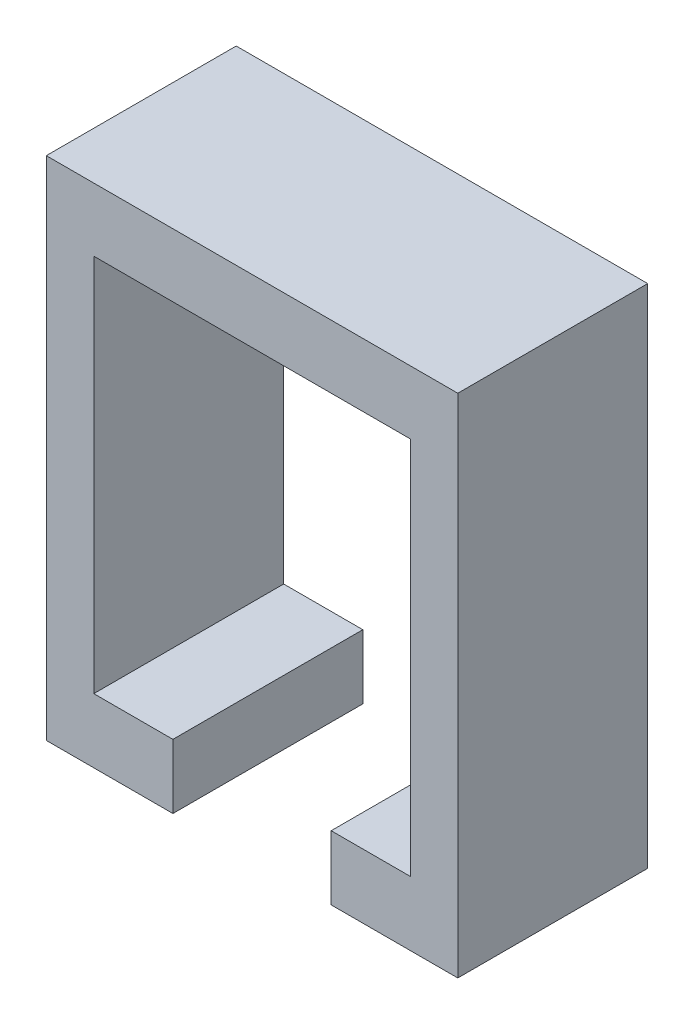
ISO-10303-21;
HEADER;
FILE_DESCRIPTION(('STEP AP214'),'2;1');
FILE_NAME('part.step','',(''),(''),'','','');
FILE_SCHEMA(('AUTOMOTIVE_DESIGN { 1 0 10303 214 1 1 1 1 }'));
ENDSEC;
DATA;
#1=APPLICATION_CONTEXT('core data for automotive mechanical design processes');
#2=APPLICATION_PROTOCOL_DEFINITION('international standard','automotive_design',2000,#1);
#3=PRODUCT_CONTEXT('',#1,'mechanical');
#4=PRODUCT('Part','Part','',(#3));
#5=PRODUCT_RELATED_PRODUCT_CATEGORY('part','',(#4));
#6=PRODUCT_DEFINITION_FORMATION('','',#4);
#7=PRODUCT_DEFINITION_CONTEXT('part definition',#1,'design');
#8=PRODUCT_DEFINITION('design','',#6,#7);
#9=PRODUCT_DEFINITION_SHAPE('','',#8);
#10=(LENGTH_UNIT() NAMED_UNIT(*) SI_UNIT(.MILLI.,.METRE.));
#11=(NAMED_UNIT(*) PLANE_ANGLE_UNIT() SI_UNIT($,.RADIAN.));
#12=(NAMED_UNIT(*) SI_UNIT($,.STERADIAN.) SOLID_ANGLE_UNIT());
#13=UNCERTAINTY_MEASURE_WITH_UNIT(LENGTH_MEASURE(1.E-05),#10,'distance_accuracy_value','');
#14=(GEOMETRIC_REPRESENTATION_CONTEXT(3) GLOBAL_UNCERTAINTY_ASSIGNED_CONTEXT((#13)) GLOBAL_UNIT_ASSIGNED_CONTEXT((#10,
#11,#12)) REPRESENTATION_CONTEXT('',''));
#15=CARTESIAN_POINT('',(0.,0.,0.));
#16=DIRECTION('',(0.,0.,1.));
#17=DIRECTION('',(1.,0.,0.));
#18=AXIS2_PLACEMENT_3D('',#15,#16,#17);
#19=CARTESIAN_POINT('',(-2.5,-16.,6.));
#20=DIRECTION('',(0.,1.,0.));
#21=DIRECTION('',(-1.,0.,0.));
#22=AXIS2_PLACEMENT_3D('',#19,#20,#21);
#23=PLANE('',#22);
#24=DIRECTION('',(1.,0.,0.));
#25=VECTOR('',#24,1.);
#26=CARTESIAN_POINT('',(-2.5,-16.,0.));
#27=LINE('',#26,#25);
#28=CARTESIAN_POINT('',(-6.5,-16.,0.));
#29=VERTEX_POINT('',#28);
#30=CARTESIAN_POINT('',(-2.5,-16.,0.));
#31=VERTEX_POINT('',#30);
#32=EDGE_CURVE('E170',#29,#31,#27,.T.);
#33=ORIENTED_EDGE('',*,*,#32,.T.);
#34=DIRECTION('',(0.,0.,-1.));
#35=VECTOR('',#34,1.);
#36=CARTESIAN_POINT('',(-2.5,-16.,6.));
#37=LINE('',#36,#35);
#38=CARTESIAN_POINT('',(-2.5,-16.,6.));
#39=VERTEX_POINT('',#38);
#40=EDGE_CURVE('E11',#39,#31,#37,.T.);
#41=ORIENTED_EDGE('',*,*,#40,.F.);
#42=DIRECTION('',(1.,0.,0.));
#43=VECTOR('',#42,1.);
#44=CARTESIAN_POINT('',(-2.5,-16.,6.));
#45=LINE('',#44,#43);
#46=CARTESIAN_POINT('',(-6.5,-16.,6.));
#47=VERTEX_POINT('',#46);
#48=EDGE_CURVE('E204',#47,#39,#45,.T.);
#49=ORIENTED_EDGE('',*,*,#48,.F.);
#50=DIRECTION('',(0.,0.,-1.));
#51=VECTOR('',#50,1.);
#52=CARTESIAN_POINT('',(-6.5,-16.,6.));
#53=LINE('',#52,#51);
#54=EDGE_CURVE('E166',#47,#29,#53,.T.);
#55=ORIENTED_EDGE('',*,*,#54,.T.);
#56=EDGE_LOOP('',(#33,#41,#49,#55));
#57=FACE_BOUND('',#56,.T.);
#58=ADVANCED_FACE('F45',(#57),#23,.F.);
#59=CARTESIAN_POINT('',(-2.5,-13.97,6.));
#60=DIRECTION('',(-1.,0.,0.));
#61=DIRECTION('',(0.,0.,1.));
#62=AXIS2_PLACEMENT_3D('',#59,#60,#61);
#63=PLANE('',#62);
#64=DIRECTION('',(0.,1.,0.));
#65=VECTOR('',#64,1.);
#66=CARTESIAN_POINT('',(-2.5,-13.97,0.));
#67=LINE('',#66,#65);
#68=CARTESIAN_POINT('',(-2.5,-13.97,0.));
#69=VERTEX_POINT('',#68);
#70=EDGE_CURVE('E174',#31,#69,#67,.T.);
#71=ORIENTED_EDGE('',*,*,#70,.T.);
#72=DIRECTION('',(0.,0.,-1.));
#73=VECTOR('',#72,1.);
#74=CARTESIAN_POINT('',(-2.5,-13.97,6.));
#75=LINE('',#74,#73);
#76=CARTESIAN_POINT('',(-2.5,-13.97,6.));
#77=VERTEX_POINT('',#76);
#78=EDGE_CURVE('E54',#77,#69,#75,.T.);
#79=ORIENTED_EDGE('',*,*,#78,.F.);
#80=DIRECTION('',(0.,1.,0.));
#81=VECTOR('',#80,1.);
#82=CARTESIAN_POINT('',(-2.5,-13.97,6.));
#83=LINE('',#82,#81);
#84=EDGE_CURVE('E117',#39,#77,#83,.T.);
#85=ORIENTED_EDGE('',*,*,#84,.F.);
#86=ORIENTED_EDGE('',*,*,#40,.T.);
#87=EDGE_LOOP('',(#71,#79,#85,#86));
#88=FACE_BOUND('',#87,.T.);
#89=ADVANCED_FACE('F298',(#88),#63,.F.);
#90=CARTESIAN_POINT('',(-5.,-13.97,6.));
#91=DIRECTION('',(0.,-1.,0.));
#92=DIRECTION('',(0.,0.,-1.));
#93=AXIS2_PLACEMENT_3D('',#90,#91,#92);
#94=PLANE('',#93);
#95=DIRECTION('',(-1.,0.,0.));
#96=VECTOR('',#95,1.);
#97=CARTESIAN_POINT('',(-5.,-13.97,0.));
#98=LINE('',#97,#96);
#99=CARTESIAN_POINT('',(-5.,-13.97,0.));
#100=VERTEX_POINT('',#99);
#101=EDGE_CURVE('E177',#69,#100,#98,.T.);
#102=ORIENTED_EDGE('',*,*,#101,.T.);
#103=DIRECTION('',(0.,0.,-1.));
#104=VECTOR('',#103,1.);
#105=CARTESIAN_POINT('',(-5.,-13.97,6.));
#106=LINE('',#105,#104);
#107=CARTESIAN_POINT('',(-5.,-13.97,6.));
#108=VERTEX_POINT('',#107);
#109=EDGE_CURVE('E231',#108,#100,#106,.T.);
#110=ORIENTED_EDGE('',*,*,#109,.F.);
#111=DIRECTION('',(-1.,0.,0.));
#112=VECTOR('',#111,1.);
#113=CARTESIAN_POINT('',(-5.,-13.97,6.));
#114=LINE('',#113,#112);
#115=EDGE_CURVE('E241',#77,#108,#114,.T.);
#116=ORIENTED_EDGE('',*,*,#115,.F.);
#117=ORIENTED_EDGE('',*,*,#78,.T.);
#118=EDGE_LOOP('',(#102,#110,#116,#117));
#119=FACE_BOUND('',#118,.T.);
#120=ADVANCED_FACE('F239',(#119),#94,.F.);
#121=CARTESIAN_POINT('',(-5.,-2.,6.));
#122=DIRECTION('',(-1.,0.,0.));
#123=DIRECTION('',(0.,0.,1.));
#124=AXIS2_PLACEMENT_3D('',#121,#122,#123);
#125=PLANE('',#124);
#126=DIRECTION('',(0.,1.,0.));
#127=VECTOR('',#126,1.);
#128=CARTESIAN_POINT('',(-5.,-2.,0.));
#129=LINE('',#128,#127);
#130=CARTESIAN_POINT('',(-5.,-2.,0.));
#131=VERTEX_POINT('',#130);
#132=EDGE_CURVE('E180',#100,#131,#129,.T.);
#133=ORIENTED_EDGE('',*,*,#132,.T.);
#134=DIRECTION('',(0.,0.,-1.));
#135=VECTOR('',#134,1.);
#136=CARTESIAN_POINT('',(-5.,-2.,6.));
#137=LINE('',#136,#135);
#138=CARTESIAN_POINT('',(-5.,-2.,6.));
#139=VERTEX_POINT('',#138);
#140=EDGE_CURVE('E227',#139,#131,#137,.T.);
#141=ORIENTED_EDGE('',*,*,#140,.F.);
#142=DIRECTION('',(0.,1.,0.));
#143=VECTOR('',#142,1.);
#144=CARTESIAN_POINT('',(-5.,-2.,6.));
#145=LINE('',#144,#143);
#146=EDGE_CURVE('E260',#108,#139,#145,.T.);
#147=ORIENTED_EDGE('',*,*,#146,.F.);
#148=ORIENTED_EDGE('',*,*,#109,.T.);
#149=EDGE_LOOP('',(#133,#141,#147,#148));
#150=FACE_BOUND('',#149,.T.);
#151=ADVANCED_FACE('F250',(#150),#125,.F.);
#152=CARTESIAN_POINT('',(-5.,-2.,6.));
#153=DIRECTION('',(0.,1.,0.));
#154=DIRECTION('',(0.,0.,1.));
#155=AXIS2_PLACEMENT_3D('',#152,#153,#154);
#156=PLANE('',#155);
#157=DIRECTION('',(1.,0.,0.));
#158=VECTOR('',#157,1.);
#159=CARTESIAN_POINT('',(-5.,-2.,0.));
#160=LINE('',#159,#158);
#161=CARTESIAN_POINT('',(5.,-2.,0.));
#162=VERTEX_POINT('',#161);
#163=EDGE_CURVE('E183',#131,#162,#160,.T.);
#164=ORIENTED_EDGE('',*,*,#163,.T.);
#165=DIRECTION('',(0.,0.,-1.));
#166=VECTOR('',#165,1.);
#167=CARTESIAN_POINT('',(5.,-2.,6.));
#168=LINE('',#167,#166);
#169=CARTESIAN_POINT('',(5.,-2.,6.));
#170=VERTEX_POINT('',#169);
#171=EDGE_CURVE('E223',#170,#162,#168,.T.);
#172=ORIENTED_EDGE('',*,*,#171,.F.);
#173=DIRECTION('',(1.,0.,0.));
#174=VECTOR('',#173,1.);
#175=CARTESIAN_POINT('',(-5.,-2.,6.));
#176=LINE('',#175,#174);
#177=EDGE_CURVE('E256',#139,#170,#176,.T.);
#178=ORIENTED_EDGE('',*,*,#177,.F.);
#179=ORIENTED_EDGE('',*,*,#140,.T.);
#180=EDGE_LOOP('',(#164,#172,#178,#179));
#181=FACE_BOUND('',#180,.T.);
#182=ADVANCED_FACE('F254',(#181),#156,.F.);
#183=CARTESIAN_POINT('',(5.,-2.,6.));
#184=DIRECTION('',(1.,0.,0.));
#185=DIRECTION('',(0.,1.,0.));
#186=AXIS2_PLACEMENT_3D('',#183,#184,#185);
#187=PLANE('',#186);
#188=DIRECTION('',(0.,-1.,0.));
#189=VECTOR('',#188,1.);
#190=CARTESIAN_POINT('',(5.,-2.,0.));
#191=LINE('',#190,#189);
#192=CARTESIAN_POINT('',(5.,-13.97,0.));
#193=VERTEX_POINT('',#192);
#194=EDGE_CURVE('E186',#162,#193,#191,.T.);
#195=ORIENTED_EDGE('',*,*,#194,.T.);
#196=DIRECTION('',(0.,0.,-1.));
#197=VECTOR('',#196,1.);
#198=CARTESIAN_POINT('',(5.,-13.97,6.));
#199=LINE('',#198,#197);
#200=CARTESIAN_POINT('',(5.,-13.97,6.));
#201=VERTEX_POINT('',#200);
#202=EDGE_CURVE('E219',#201,#193,#199,.T.);
#203=ORIENTED_EDGE('',*,*,#202,.F.);
#204=DIRECTION('',(0.,-1.,0.));
#205=VECTOR('',#204,1.);
#206=CARTESIAN_POINT('',(5.,-2.,6.));
#207=LINE('',#206,#205);
#208=EDGE_CURVE('E259',#170,#201,#207,.T.);
#209=ORIENTED_EDGE('',*,*,#208,.F.);
#210=ORIENTED_EDGE('',*,*,#171,.T.);
#211=EDGE_LOOP('',(#195,#203,#209,#210));
#212=FACE_BOUND('',#211,.T.);
#213=ADVANCED_FACE('F311',(#212),#187,.F.);
#214=CARTESIAN_POINT('',(5.,-13.97,6.));
#215=DIRECTION('',(0.,-1.,0.));
#216=DIRECTION('',(0.,0.,-1.));
#217=AXIS2_PLACEMENT_3D('',#214,#215,#216);
#218=PLANE('',#217);
#219=DIRECTION('',(-1.,0.,0.));
#220=VECTOR('',#219,1.);
#221=CARTESIAN_POINT('',(5.,-13.97,0.));
#222=LINE('',#221,#220);
#223=CARTESIAN_POINT('',(2.5,-13.97,0.));
#224=VERTEX_POINT('',#223);
#225=EDGE_CURVE('E189',#193,#224,#222,.T.);
#226=ORIENTED_EDGE('',*,*,#225,.T.);
#227=DIRECTION('',(0.,0.,-1.));
#228=VECTOR('',#227,1.);
#229=CARTESIAN_POINT('',(2.5,-13.97,6.));
#230=LINE('',#229,#228);
#231=CARTESIAN_POINT('',(2.5,-13.97,6.));
#232=VERTEX_POINT('',#231);
#233=EDGE_CURVE('E215',#232,#224,#230,.T.);
#234=ORIENTED_EDGE('',*,*,#233,.F.);
#235=DIRECTION('',(-1.,0.,0.));
#236=VECTOR('',#235,1.);
#237=CARTESIAN_POINT('',(5.,-13.97,6.));
#238=LINE('',#237,#236);
#239=EDGE_CURVE('E264',#201,#232,#238,.T.);
#240=ORIENTED_EDGE('',*,*,#239,.F.);
#241=ORIENTED_EDGE('',*,*,#202,.T.);
#242=EDGE_LOOP('',(#226,#234,#240,#241));
#243=FACE_BOUND('',#242,.T.);
#244=ADVANCED_FACE('F314',(#243),#218,.F.);
#245=CARTESIAN_POINT('',(2.5,-13.97,6.));
#246=DIRECTION('',(1.,0.,0.));
#247=DIRECTION('',(0.,0.,-1.));
#248=AXIS2_PLACEMENT_3D('',#245,#246,#247);
#249=PLANE('',#248);
#250=DIRECTION('',(0.,-1.,0.));
#251=VECTOR('',#250,1.);
#252=CARTESIAN_POINT('',(2.5,-13.97,0.));
#253=LINE('',#252,#251);
#254=CARTESIAN_POINT('',(2.5,-16.,0.));
#255=VERTEX_POINT('',#254);
#256=EDGE_CURVE('E192',#224,#255,#253,.T.);
#257=ORIENTED_EDGE('',*,*,#256,.T.);
#258=DIRECTION('',(0.,0.,-1.));
#259=VECTOR('',#258,1.);
#260=CARTESIAN_POINT('',(2.5,-16.,6.));
#261=LINE('',#260,#259);
#262=CARTESIAN_POINT('',(2.5,-16.,6.));
#263=VERTEX_POINT('',#262);
#264=EDGE_CURVE('E211',#263,#255,#261,.T.);
#265=ORIENTED_EDGE('',*,*,#264,.F.);
#266=DIRECTION('',(0.,-1.,0.));
#267=VECTOR('',#266,1.);
#268=CARTESIAN_POINT('',(2.5,-13.97,6.));
#269=LINE('',#268,#267);
#270=EDGE_CURVE('E271',#232,#263,#269,.T.);
#271=ORIENTED_EDGE('',*,*,#270,.F.);
#272=ORIENTED_EDGE('',*,*,#233,.T.);
#273=EDGE_LOOP('',(#257,#265,#271,#272));
#274=FACE_BOUND('',#273,.T.);
#275=ADVANCED_FACE('F279',(#274),#249,.F.);
#276=CARTESIAN_POINT('',(2.5,-16.,6.));
#277=DIRECTION('',(0.,1.,0.));
#278=DIRECTION('',(0.,0.,1.));
#279=AXIS2_PLACEMENT_3D('',#276,#277,#278);
#280=PLANE('',#279);
#281=DIRECTION('',(1.,0.,0.));
#282=VECTOR('',#281,1.);
#283=CARTESIAN_POINT('',(2.5,-16.,0.));
#284=LINE('',#283,#282);
#285=CARTESIAN_POINT('',(6.50000000000001,-16.,0.));
#286=VERTEX_POINT('',#285);
#287=EDGE_CURVE('E195',#255,#286,#284,.T.);
#288=ORIENTED_EDGE('',*,*,#287,.T.);
#289=DIRECTION('',(0.,0.,-1.));
#290=VECTOR('',#289,1.);
#291=CARTESIAN_POINT('',(6.50000000000001,-16.,6.));
#292=LINE('',#291,#290);
#293=CARTESIAN_POINT('',(6.50000000000001,-16.,6.));
#294=VERTEX_POINT('',#293);
#295=EDGE_CURVE('E159',#294,#286,#292,.T.);
#296=ORIENTED_EDGE('',*,*,#295,.F.);
#297=DIRECTION('',(1.,0.,0.));
#298=VECTOR('',#297,1.);
#299=CARTESIAN_POINT('',(2.5,-16.,6.));
#300=LINE('',#299,#298);
#301=EDGE_CURVE('E148',#263,#294,#300,.T.);
#302=ORIENTED_EDGE('',*,*,#301,.F.);
#303=ORIENTED_EDGE('',*,*,#264,.T.);
#304=EDGE_LOOP('',(#288,#296,#302,#303));
#305=FACE_BOUND('',#304,.T.);
#306=ADVANCED_FACE('F283',(#305),#280,.F.);
#307=CARTESIAN_POINT('',(6.5,0.,6.));
#308=DIRECTION('',(-1.,0.,0.));
#309=DIRECTION('',(0.,-1.,0.));
#310=AXIS2_PLACEMENT_3D('',#307,#308,#309);
#311=PLANE('',#310);
#312=DIRECTION('',(0.,1.,0.));
#313=VECTOR('',#312,1.);
#314=CARTESIAN_POINT('',(6.5,0.,0.));
#315=LINE('',#314,#313);
#316=CARTESIAN_POINT('',(6.5,0.,0.));
#317=VERTEX_POINT('',#316);
#318=EDGE_CURVE('E157',#286,#317,#315,.T.);
#319=ORIENTED_EDGE('',*,*,#318,.T.);
#320=DIRECTION('',(0.,0.,-1.));
#321=VECTOR('',#320,1.);
#322=CARTESIAN_POINT('',(6.5,0.,6.));
#323=LINE('',#322,#321);
#324=CARTESIAN_POINT('',(6.5,0.,6.));
#325=VERTEX_POINT('',#324);
#326=EDGE_CURVE('E154',#325,#317,#323,.T.);
#327=ORIENTED_EDGE('',*,*,#326,.F.);
#328=DIRECTION('',(0.,1.,0.));
#329=VECTOR('',#328,1.);
#330=CARTESIAN_POINT('',(6.5,0.,6.));
#331=LINE('',#330,#329);
#332=EDGE_CURVE('E142',#294,#325,#331,.T.);
#333=ORIENTED_EDGE('',*,*,#332,.F.);
#334=ORIENTED_EDGE('',*,*,#295,.T.);
#335=EDGE_LOOP('',(#319,#327,#333,#334));
#336=FACE_BOUND('',#335,.T.);
#337=ADVANCED_FACE('F155',(#336),#311,.F.);
#338=CARTESIAN_POINT('',(-6.5,0.,6.));
#339=DIRECTION('',(0.,-1.,0.));
#340=DIRECTION('',(1.,0.,0.));
#341=AXIS2_PLACEMENT_3D('',#338,#339,#340);
#342=PLANE('',#341);
#343=DIRECTION('',(-1.,0.,0.));
#344=VECTOR('',#343,1.);
#345=CARTESIAN_POINT('',(-6.5,0.,0.));
#346=LINE('',#345,#344);
#347=CARTESIAN_POINT('',(-6.5,0.,0.));
#348=VERTEX_POINT('',#347);
#349=EDGE_CURVE('E103',#317,#348,#346,.T.);
#350=ORIENTED_EDGE('',*,*,#349,.T.);
#351=DIRECTION('',(0.,0.,-1.));
#352=VECTOR('',#351,1.);
#353=CARTESIAN_POINT('',(-6.5,0.,6.));
#354=LINE('',#353,#352);
#355=CARTESIAN_POINT('',(-6.5,0.,6.));
#356=VERTEX_POINT('',#355);
#357=EDGE_CURVE('E160',#356,#348,#354,.T.);
#358=ORIENTED_EDGE('',*,*,#357,.F.);
#359=DIRECTION('',(-1.,0.,0.));
#360=VECTOR('',#359,1.);
#361=CARTESIAN_POINT('',(-6.5,0.,6.));
#362=LINE('',#361,#360);
#363=EDGE_CURVE('E146',#325,#356,#362,.T.);
#364=ORIENTED_EDGE('',*,*,#363,.F.);
#365=ORIENTED_EDGE('',*,*,#326,.T.);
#366=EDGE_LOOP('',(#350,#358,#364,#365));
#367=FACE_BOUND('',#366,.T.);
#368=ADVANCED_FACE('F162',(#367),#342,.F.);
#369=CARTESIAN_POINT('',(-6.5,-16.,6.));
#370=DIRECTION('',(1.,0.,0.));
#371=DIRECTION('',(0.,0.,-1.));
#372=AXIS2_PLACEMENT_3D('',#369,#370,#371);
#373=PLANE('',#372);
#374=DIRECTION('',(0.,-1.,0.));
#375=VECTOR('',#374,1.);
#376=CARTESIAN_POINT('',(-6.5,-16.,0.));
#377=LINE('',#376,#375);
#378=EDGE_CURVE('E109',#348,#29,#377,.T.);
#379=ORIENTED_EDGE('',*,*,#378,.T.);
#380=ORIENTED_EDGE('',*,*,#54,.F.);
#381=DIRECTION('',(0.,-1.,0.));
#382=VECTOR('',#381,1.);
#383=CARTESIAN_POINT('',(-6.5,-16.,6.));
#384=LINE('',#383,#382);
#385=EDGE_CURVE('E62',#356,#47,#384,.T.);
#386=ORIENTED_EDGE('',*,*,#385,.F.);
#387=ORIENTED_EDGE('',*,*,#357,.T.);
#388=EDGE_LOOP('',(#379,#380,#386,#387));
#389=FACE_BOUND('',#388,.T.);
#390=ADVANCED_FACE('F287',(#389),#373,.F.);
#391=CARTESIAN_POINT('',(0.,0.,6.));
#392=DIRECTION('',(0.,0.,-1.));
#393=DIRECTION('',(-1.,0.,0.));
#394=AXIS2_PLACEMENT_3D('',#391,#392,#393);
#395=PLANE('',#394);
#396=ORIENTED_EDGE('',*,*,#48,.T.);
#397=ORIENTED_EDGE('',*,*,#84,.T.);
#398=ORIENTED_EDGE('',*,*,#115,.T.);
#399=ORIENTED_EDGE('',*,*,#146,.T.);
#400=ORIENTED_EDGE('',*,*,#177,.T.);
#401=ORIENTED_EDGE('',*,*,#208,.T.);
#402=ORIENTED_EDGE('',*,*,#239,.T.);
#403=ORIENTED_EDGE('',*,*,#270,.T.);
#404=ORIENTED_EDGE('',*,*,#301,.T.);
#405=ORIENTED_EDGE('',*,*,#332,.T.);
#406=ORIENTED_EDGE('',*,*,#363,.T.);
#407=ORIENTED_EDGE('',*,*,#385,.T.);
#408=EDGE_LOOP('',(#396,#397,#398,#399,#400,#401,#402,#403,#404,#405,#406,#407));
#409=FACE_BOUND('',#408,.T.);
#410=ADVANCED_FACE('F144',(#409),#395,.F.);
#411=CARTESIAN_POINT('',(0.,0.,0.));
#412=DIRECTION('',(0.,0.,-1.));
#413=DIRECTION('',(-1.,0.,0.));
#414=AXIS2_PLACEMENT_3D('',#411,#412,#413);
#415=PLANE('',#414);
#416=ORIENTED_EDGE('',*,*,#32,.F.);
#417=ORIENTED_EDGE('',*,*,#378,.F.);
#418=ORIENTED_EDGE('',*,*,#349,.F.);
#419=ORIENTED_EDGE('',*,*,#318,.F.);
#420=ORIENTED_EDGE('',*,*,#287,.F.);
#421=ORIENTED_EDGE('',*,*,#256,.F.);
#422=ORIENTED_EDGE('',*,*,#225,.F.);
#423=ORIENTED_EDGE('',*,*,#194,.F.);
#424=ORIENTED_EDGE('',*,*,#163,.F.);
#425=ORIENTED_EDGE('',*,*,#132,.F.);
#426=ORIENTED_EDGE('',*,*,#101,.F.);
#427=ORIENTED_EDGE('',*,*,#70,.F.);
#428=EDGE_LOOP('',(#416,#417,#418,#419,#420,#421,#422,#423,#424,#425,#426,#427));
#429=FACE_BOUND('',#428,.T.);
#430=ADVANCED_FACE('F245',(#429),#415,.T.);
#431=CLOSED_SHELL('',(#58,#89,#120,#151,#182,#213,#244,#275,#306,#337,#368,#390,#410,#430));
#432=MANIFOLD_SOLID_BREP('B2',#431);
#433=ADVANCED_BREP_SHAPE_REPRESENTATION('',(#18,#432),#14);
#434=SHAPE_DEFINITION_REPRESENTATION(#9,#433);
ENDSEC;
END-ISO-10303-21;
